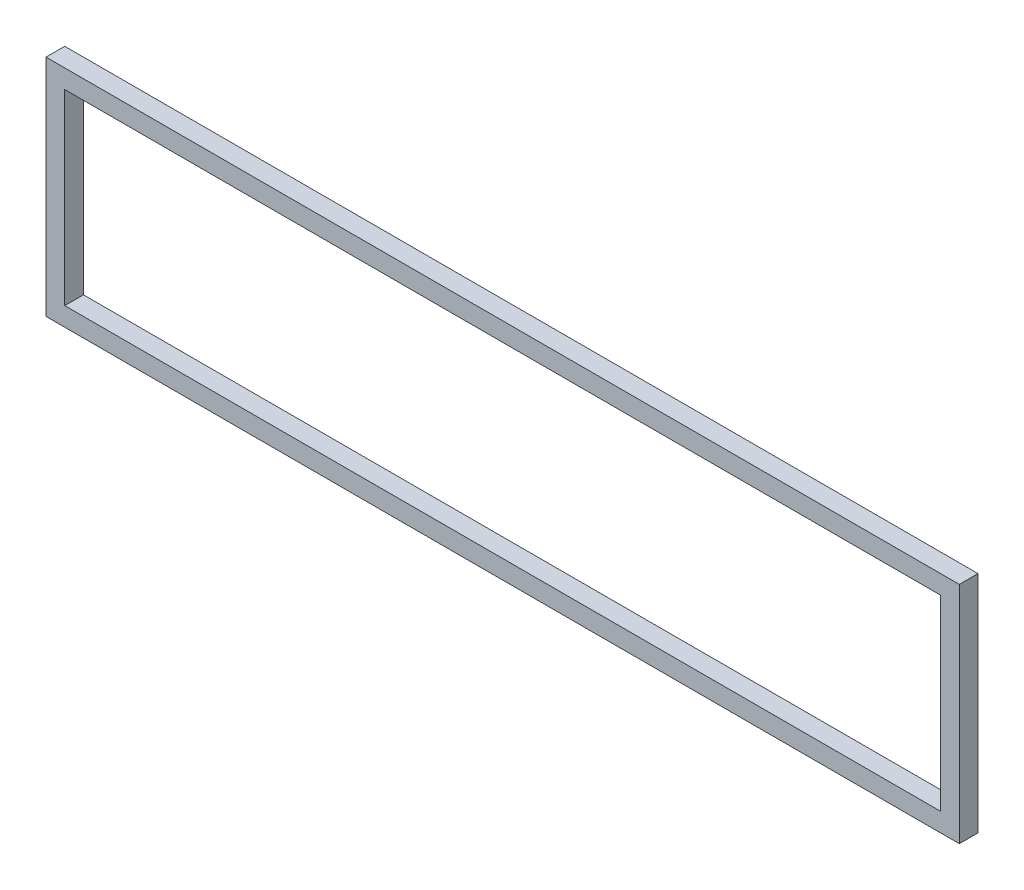
ISO-10303-21;
HEADER;
FILE_DESCRIPTION(('STEP AP214'),'2;1');
FILE_NAME('part.step','',(''),(''),'','','');
FILE_SCHEMA(('AUTOMOTIVE_DESIGN { 1 0 10303 214 1 1 1 1 }'));
ENDSEC;
DATA;
#1=APPLICATION_CONTEXT('core data for automotive mechanical design processes');
#2=APPLICATION_PROTOCOL_DEFINITION('international standard','automotive_design',2000,#1);
#3=PRODUCT_CONTEXT('',#1,'mechanical');
#4=PRODUCT('Part','Part','',(#3));
#5=PRODUCT_RELATED_PRODUCT_CATEGORY('part','',(#4));
#6=PRODUCT_DEFINITION_FORMATION('','',#4);
#7=PRODUCT_DEFINITION_CONTEXT('part definition',#1,'design');
#8=PRODUCT_DEFINITION('design','',#6,#7);
#9=PRODUCT_DEFINITION_SHAPE('','',#8);
#10=(LENGTH_UNIT() NAMED_UNIT(*) SI_UNIT(.MILLI.,.METRE.));
#11=(NAMED_UNIT(*) PLANE_ANGLE_UNIT() SI_UNIT($,.RADIAN.));
#12=(NAMED_UNIT(*) SI_UNIT($,.STERADIAN.) SOLID_ANGLE_UNIT());
#13=UNCERTAINTY_MEASURE_WITH_UNIT(LENGTH_MEASURE(1.E-05),#10,'distance_accuracy_value','');
#14=(GEOMETRIC_REPRESENTATION_CONTEXT(3) GLOBAL_UNCERTAINTY_ASSIGNED_CONTEXT((#13)) GLOBAL_UNIT_ASSIGNED_CONTEXT((#10,
#11,#12)) REPRESENTATION_CONTEXT('',''));
#15=CARTESIAN_POINT('',(0.,0.,0.));
#16=DIRECTION('',(0.,0.,1.));
#17=DIRECTION('',(1.,0.,0.));
#18=AXIS2_PLACEMENT_3D('',#15,#16,#17);
#19=CARTESIAN_POINT('',(0.,0.,50.));
#20=DIRECTION('',(0.,0.,-1.));
#21=DIRECTION('',(-1.,0.,0.));
#22=AXIS2_PLACEMENT_3D('',#19,#20,#21);
#23=PLANE('',#22);
#24=DIRECTION('',(0.,-1.,0.));
#25=VECTOR('',#24,1.);
#26=CARTESIAN_POINT('',(-693.617021276596,-355.31914893617,50.));
#27=LINE('',#26,#25);
#28=CARTESIAN_POINT('',(-693.617021276596,244.68085106383,50.));
#29=VERTEX_POINT('',#28);
#30=CARTESIAN_POINT('',(-693.617021276596,-355.31914893617,50.));
#31=VERTEX_POINT('',#30);
#32=EDGE_CURVE('E159',#29,#31,#27,.T.);
#33=ORIENTED_EDGE('',*,*,#32,.T.);
#34=DIRECTION('',(1.,0.,0.));
#35=VECTOR('',#34,1.);
#36=CARTESIAN_POINT('',(-693.617021276596,-355.31914893617,50.));
#37=LINE('',#36,#35);
#38=CARTESIAN_POINT('',(1746.3829787234,-355.31914893617,50.));
#39=VERTEX_POINT('',#38);
#40=EDGE_CURVE('E163',#31,#39,#37,.T.);
#41=ORIENTED_EDGE('',*,*,#40,.T.);
#42=DIRECTION('',(0.,1.,0.));
#43=VECTOR('',#42,1.);
#44=CARTESIAN_POINT('',(1746.3829787234,-355.31914893617,50.));
#45=LINE('',#44,#43);
#46=CARTESIAN_POINT('',(1746.3829787234,244.68085106383,50.));
#47=VERTEX_POINT('',#46);
#48=EDGE_CURVE('E167',#39,#47,#45,.T.);
#49=ORIENTED_EDGE('',*,*,#48,.T.);
#50=DIRECTION('',(-1.,0.,0.));
#51=VECTOR('',#50,1.);
#52=CARTESIAN_POINT('',(-693.617021276596,244.68085106383,50.));
#53=LINE('',#52,#51);
#54=EDGE_CURVE('E170',#47,#29,#53,.T.);
#55=ORIENTED_EDGE('',*,*,#54,.T.);
#56=EDGE_LOOP('',(#33,#41,#49,#55));
#57=FACE_BOUND('',#56,.T.);
#58=DIRECTION('',(1.,0.,0.));
#59=VECTOR('',#58,1.);
#60=CARTESIAN_POINT('',(-643.617021276595,-305.31914893617,50.));
#61=LINE('',#60,#59);
#62=CARTESIAN_POINT('',(-643.617021276595,-305.31914893617,50.));
#63=VERTEX_POINT('',#62);
#64=CARTESIAN_POINT('',(1696.3829787234,-305.31914893617,50.));
#65=VERTEX_POINT('',#64);
#66=EDGE_CURVE('E111',#63,#65,#61,.T.);
#67=ORIENTED_EDGE('',*,*,#66,.F.);
#68=DIRECTION('',(0.,-1.,0.));
#69=VECTOR('',#68,1.);
#70=CARTESIAN_POINT('',(-643.617021276595,-305.31914893617,50.));
#71=LINE('',#70,#69);
#72=CARTESIAN_POINT('',(-643.617021276595,194.68085106383,50.));
#73=VERTEX_POINT('',#72);
#74=EDGE_CURVE('E137',#73,#63,#71,.T.);
#75=ORIENTED_EDGE('',*,*,#74,.F.);
#76=DIRECTION('',(-1.,0.,0.));
#77=VECTOR('',#76,1.);
#78=CARTESIAN_POINT('',(-643.617021276595,194.68085106383,50.));
#79=LINE('',#78,#77);
#80=CARTESIAN_POINT('',(1696.3829787234,194.68085106383,50.));
#81=VERTEX_POINT('',#80);
#82=EDGE_CURVE('E133',#81,#73,#79,.T.);
#83=ORIENTED_EDGE('',*,*,#82,.F.);
#84=DIRECTION('',(0.,1.,0.));
#85=VECTOR('',#84,1.);
#86=CARTESIAN_POINT('',(1696.3829787234,-305.31914893617,50.));
#87=LINE('',#86,#85);
#88=EDGE_CURVE('E120',#65,#81,#87,.T.);
#89=ORIENTED_EDGE('',*,*,#88,.F.);
#90=EDGE_LOOP('',(#67,#75,#83,#89));
#91=FACE_BOUND('',#90,.T.);
#92=ADVANCED_FACE('F45',(#57,#91),#23,.F.);
#93=CARTESIAN_POINT('',(0.,0.,0.));
#94=DIRECTION('',(0.,0.,-1.));
#95=DIRECTION('',(-1.,0.,0.));
#96=AXIS2_PLACEMENT_3D('',#93,#94,#95);
#97=PLANE('',#96);
#98=DIRECTION('',(0.,-1.,0.));
#99=VECTOR('',#98,1.);
#100=CARTESIAN_POINT('',(-693.617021276596,-355.31914893617,0.));
#101=LINE('',#100,#99);
#102=CARTESIAN_POINT('',(-693.617021276596,244.68085106383,0.));
#103=VERTEX_POINT('',#102);
#104=CARTESIAN_POINT('',(-693.617021276596,-355.31914893617,0.));
#105=VERTEX_POINT('',#104);
#106=EDGE_CURVE('E129',#103,#105,#101,.T.);
#107=ORIENTED_EDGE('',*,*,#106,.F.);
#108=DIRECTION('',(-1.,0.,0.));
#109=VECTOR('',#108,1.);
#110=CARTESIAN_POINT('',(-693.617021276596,244.68085106383,0.));
#111=LINE('',#110,#109);
#112=CARTESIAN_POINT('',(1746.3829787234,244.68085106383,0.));
#113=VERTEX_POINT('',#112);
#114=EDGE_CURVE('E164',#113,#103,#111,.T.);
#115=ORIENTED_EDGE('',*,*,#114,.F.);
#116=DIRECTION('',(0.,1.,0.));
#117=VECTOR('',#116,1.);
#118=CARTESIAN_POINT('',(1746.3829787234,-355.31914893617,0.));
#119=LINE('',#118,#117);
#120=CARTESIAN_POINT('',(1746.3829787234,-355.31914893617,0.));
#121=VERTEX_POINT('',#120);
#122=EDGE_CURVE('E180',#121,#113,#119,.T.);
#123=ORIENTED_EDGE('',*,*,#122,.F.);
#124=DIRECTION('',(1.,0.,0.));
#125=VECTOR('',#124,1.);
#126=CARTESIAN_POINT('',(-693.617021276596,-355.31914893617,0.));
#127=LINE('',#126,#125);
#128=EDGE_CURVE('E177',#105,#121,#127,.T.);
#129=ORIENTED_EDGE('',*,*,#128,.F.);
#130=EDGE_LOOP('',(#107,#115,#123,#129));
#131=FACE_BOUND('',#130,.T.);
#132=DIRECTION('',(0.,-1.,0.));
#133=VECTOR('',#132,1.);
#134=CARTESIAN_POINT('',(-643.617021276595,-305.31914893617,0.));
#135=LINE('',#134,#133);
#136=CARTESIAN_POINT('',(-643.617021276595,194.68085106383,0.));
#137=VERTEX_POINT('',#136);
#138=CARTESIAN_POINT('',(-643.617021276595,-305.31914893617,0.));
#139=VERTEX_POINT('',#138);
#140=EDGE_CURVE('E121',#137,#139,#135,.T.);
#141=ORIENTED_EDGE('',*,*,#140,.T.);
#142=DIRECTION('',(1.,0.,0.));
#143=VECTOR('',#142,1.);
#144=CARTESIAN_POINT('',(-643.617021276595,-305.31914893617,0.));
#145=LINE('',#144,#143);
#146=CARTESIAN_POINT('',(1696.3829787234,-305.31914893617,0.));
#147=VERTEX_POINT('',#146);
#148=EDGE_CURVE('E69',#139,#147,#145,.T.);
#149=ORIENTED_EDGE('',*,*,#148,.T.);
#150=DIRECTION('',(0.,1.,0.));
#151=VECTOR('',#150,1.);
#152=CARTESIAN_POINT('',(1696.3829787234,-305.31914893617,0.));
#153=LINE('',#152,#151);
#154=CARTESIAN_POINT('',(1696.3829787234,194.68085106383,0.));
#155=VERTEX_POINT('',#154);
#156=EDGE_CURVE('E127',#147,#155,#153,.T.);
#157=ORIENTED_EDGE('',*,*,#156,.T.);
#158=DIRECTION('',(-1.,0.,0.));
#159=VECTOR('',#158,1.);
#160=CARTESIAN_POINT('',(-643.617021276595,194.68085106383,0.));
#161=LINE('',#160,#159);
#162=EDGE_CURVE('E146',#155,#137,#161,.T.);
#163=ORIENTED_EDGE('',*,*,#162,.T.);
#164=EDGE_LOOP('',(#141,#149,#157,#163));
#165=FACE_BOUND('',#164,.T.);
#166=ADVANCED_FACE('F203',(#131,#165),#97,.T.);
#167=CARTESIAN_POINT('',(-693.617021276596,-355.31914893617,50.));
#168=DIRECTION('',(1.,0.,0.));
#169=DIRECTION('',(0.,0.,-1.));
#170=AXIS2_PLACEMENT_3D('',#167,#168,#169);
#171=PLANE('',#170);
#172=ORIENTED_EDGE('',*,*,#106,.T.);
#173=DIRECTION('',(0.,0.,-1.));
#174=VECTOR('',#173,1.);
#175=CARTESIAN_POINT('',(-693.617021276596,-355.31914893617,50.));
#176=LINE('',#175,#174);
#177=EDGE_CURVE('E11',#31,#105,#176,.T.);
#178=ORIENTED_EDGE('',*,*,#177,.F.);
#179=ORIENTED_EDGE('',*,*,#32,.F.);
#180=DIRECTION('',(0.,0.,-1.));
#181=VECTOR('',#180,1.);
#182=CARTESIAN_POINT('',(-693.617021276596,244.68085106383,50.));
#183=LINE('',#182,#181);
#184=EDGE_CURVE('E173',#29,#103,#183,.T.);
#185=ORIENTED_EDGE('',*,*,#184,.T.);
#186=EDGE_LOOP('',(#172,#178,#179,#185));
#187=FACE_BOUND('',#186,.T.);
#188=ADVANCED_FACE('F47',(#187),#171,.F.);
#189=CARTESIAN_POINT('',(-693.617021276596,-355.31914893617,50.));
#190=DIRECTION('',(0.,1.,0.));
#191=DIRECTION('',(0.,0.,1.));
#192=AXIS2_PLACEMENT_3D('',#189,#190,#191);
#193=PLANE('',#192);
#194=ORIENTED_EDGE('',*,*,#128,.T.);
#195=DIRECTION('',(0.,0.,-1.));
#196=VECTOR('',#195,1.);
#197=CARTESIAN_POINT('',(1746.3829787234,-355.31914893617,50.));
#198=LINE('',#197,#196);
#199=EDGE_CURVE('E54',#39,#121,#198,.T.);
#200=ORIENTED_EDGE('',*,*,#199,.F.);
#201=ORIENTED_EDGE('',*,*,#40,.F.);
#202=ORIENTED_EDGE('',*,*,#177,.T.);
#203=EDGE_LOOP('',(#194,#200,#201,#202));
#204=FACE_BOUND('',#203,.T.);
#205=ADVANCED_FACE('F213',(#204),#193,.F.);
#206=CARTESIAN_POINT('',(1746.3829787234,-355.31914893617,50.));
#207=DIRECTION('',(-1.,0.,0.));
#208=DIRECTION('',(0.,0.,1.));
#209=AXIS2_PLACEMENT_3D('',#206,#207,#208);
#210=PLANE('',#209);
#211=ORIENTED_EDGE('',*,*,#122,.T.);
#212=DIRECTION('',(0.,0.,-1.));
#213=VECTOR('',#212,1.);
#214=CARTESIAN_POINT('',(1746.3829787234,244.68085106383,50.));
#215=LINE('',#214,#213);
#216=EDGE_CURVE('E188',#47,#113,#215,.T.);
#217=ORIENTED_EDGE('',*,*,#216,.F.);
#218=ORIENTED_EDGE('',*,*,#48,.F.);
#219=ORIENTED_EDGE('',*,*,#199,.T.);
#220=EDGE_LOOP('',(#211,#217,#218,#219));
#221=FACE_BOUND('',#220,.T.);
#222=ADVANCED_FACE('F197',(#221),#210,.F.);
#223=CARTESIAN_POINT('',(-693.617021276596,244.68085106383,50.));
#224=DIRECTION('',(0.,-1.,0.));
#225=DIRECTION('',(0.,0.,-1.));
#226=AXIS2_PLACEMENT_3D('',#223,#224,#225);
#227=PLANE('',#226);
#228=ORIENTED_EDGE('',*,*,#114,.T.);
#229=ORIENTED_EDGE('',*,*,#184,.F.);
#230=ORIENTED_EDGE('',*,*,#54,.F.);
#231=ORIENTED_EDGE('',*,*,#216,.T.);
#232=EDGE_LOOP('',(#228,#229,#230,#231));
#233=FACE_BOUND('',#232,.T.);
#234=ADVANCED_FACE('F207',(#233),#227,.F.);
#235=CARTESIAN_POINT('',(-643.617021276595,-305.31914893617,50.));
#236=DIRECTION('',(0.,1.,0.));
#237=DIRECTION('',(0.,0.,1.));
#238=AXIS2_PLACEMENT_3D('',#235,#236,#237);
#239=PLANE('',#238);
#240=ORIENTED_EDGE('',*,*,#148,.F.);
#241=DIRECTION('',(0.,0.,-1.));
#242=VECTOR('',#241,1.);
#243=CARTESIAN_POINT('',(-643.617021276595,-305.31914893617,50.));
#244=LINE('',#243,#242);
#245=EDGE_CURVE('E115',#63,#139,#244,.T.);
#246=ORIENTED_EDGE('',*,*,#245,.F.);
#247=ORIENTED_EDGE('',*,*,#66,.T.);
#248=DIRECTION('',(0.,0.,-1.));
#249=VECTOR('',#248,1.);
#250=CARTESIAN_POINT('',(1696.3829787234,-305.31914893617,50.));
#251=LINE('',#250,#249);
#252=EDGE_CURVE('E114',#65,#147,#251,.T.);
#253=ORIENTED_EDGE('',*,*,#252,.T.);
#254=EDGE_LOOP('',(#240,#246,#247,#253));
#255=FACE_BOUND('',#254,.T.);
#256=ADVANCED_FACE('F113',(#255),#239,.T.);
#257=CARTESIAN_POINT('',(1696.3829787234,-305.31914893617,50.));
#258=DIRECTION('',(-1.,0.,0.));
#259=DIRECTION('',(0.,-1.,0.));
#260=AXIS2_PLACEMENT_3D('',#257,#258,#259);
#261=PLANE('',#260);
#262=ORIENTED_EDGE('',*,*,#156,.F.);
#263=ORIENTED_EDGE('',*,*,#252,.F.);
#264=ORIENTED_EDGE('',*,*,#88,.T.);
#265=DIRECTION('',(0.,0.,-1.));
#266=VECTOR('',#265,1.);
#267=CARTESIAN_POINT('',(1696.3829787234,194.68085106383,50.));
#268=LINE('',#267,#266);
#269=EDGE_CURVE('E130',#81,#155,#268,.T.);
#270=ORIENTED_EDGE('',*,*,#269,.T.);
#271=EDGE_LOOP('',(#262,#263,#264,#270));
#272=FACE_BOUND('',#271,.T.);
#273=ADVANCED_FACE('F124',(#272),#261,.T.);
#274=CARTESIAN_POINT('',(-643.617021276595,194.68085106383,50.));
#275=DIRECTION('',(0.,-1.,0.));
#276=DIRECTION('',(0.,0.,-1.));
#277=AXIS2_PLACEMENT_3D('',#274,#275,#276);
#278=PLANE('',#277);
#279=ORIENTED_EDGE('',*,*,#162,.F.);
#280=ORIENTED_EDGE('',*,*,#269,.F.);
#281=ORIENTED_EDGE('',*,*,#82,.T.);
#282=DIRECTION('',(0.,0.,-1.));
#283=VECTOR('',#282,1.);
#284=CARTESIAN_POINT('',(-643.617021276595,194.68085106383,50.));
#285=LINE('',#284,#283);
#286=EDGE_CURVE('E61',#73,#137,#285,.T.);
#287=ORIENTED_EDGE('',*,*,#286,.T.);
#288=EDGE_LOOP('',(#279,#280,#281,#287));
#289=FACE_BOUND('',#288,.T.);
#290=ADVANCED_FACE('F236',(#289),#278,.T.);
#291=CARTESIAN_POINT('',(-643.617021276595,-305.31914893617,50.));
#292=DIRECTION('',(1.,0.,0.));
#293=DIRECTION('',(0.,0.,-1.));
#294=AXIS2_PLACEMENT_3D('',#291,#292,#293);
#295=PLANE('',#294);
#296=ORIENTED_EDGE('',*,*,#140,.F.);
#297=ORIENTED_EDGE('',*,*,#286,.F.);
#298=ORIENTED_EDGE('',*,*,#74,.T.);
#299=ORIENTED_EDGE('',*,*,#245,.T.);
#300=EDGE_LOOP('',(#296,#297,#298,#299));
#301=FACE_BOUND('',#300,.T.);
#302=ADVANCED_FACE('F240',(#301),#295,.T.);
#303=CLOSED_SHELL('',(#92,#166,#188,#205,#222,#234,#256,#273,#290,#302));
#304=MANIFOLD_SOLID_BREP('B2',#303);
#305=ADVANCED_BREP_SHAPE_REPRESENTATION('',(#18,#304),#14);
#306=SHAPE_DEFINITION_REPRESENTATION(#9,#305);
ENDSEC;
END-ISO-10303-21;
